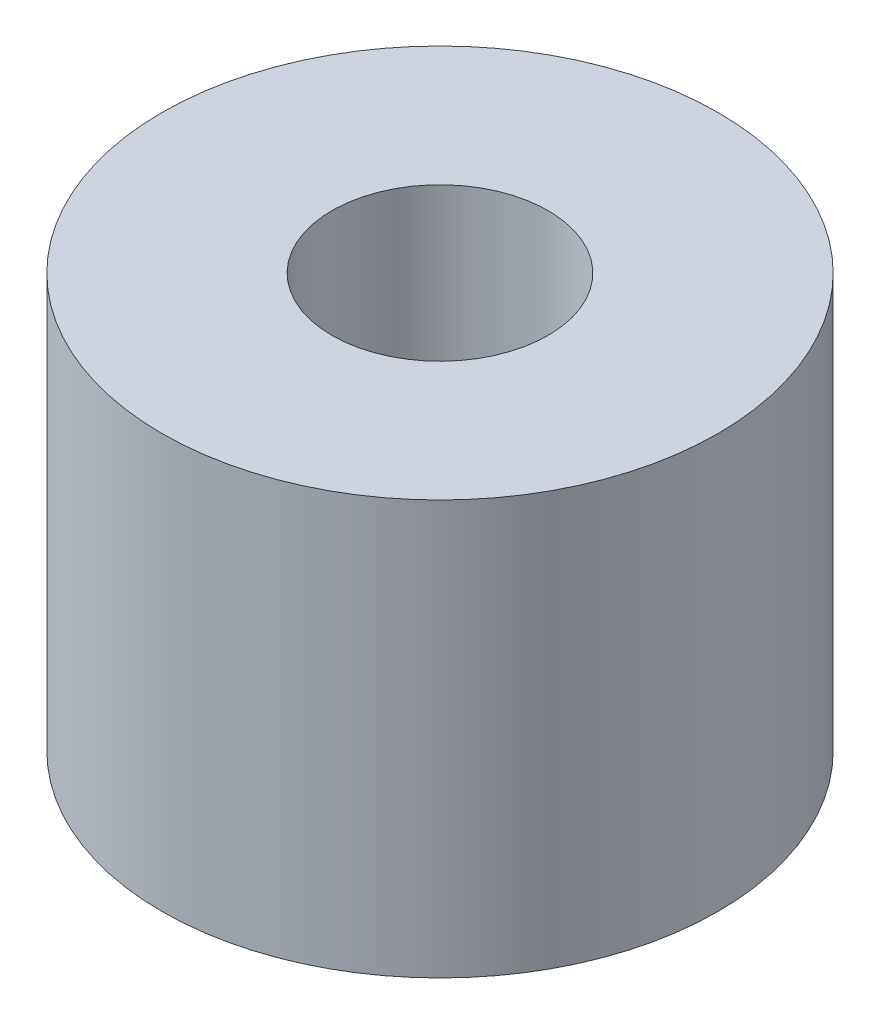
ISO-10303-21;
HEADER;
FILE_DESCRIPTION(('STEP AP214'),'2;1');
FILE_NAME('part.step','',(''),(''),'','','');
FILE_SCHEMA(('AUTOMOTIVE_DESIGN { 1 0 10303 214 1 1 1 1 }'));
ENDSEC;
DATA;
#1=APPLICATION_CONTEXT('core data for automotive mechanical design processes');
#2=APPLICATION_PROTOCOL_DEFINITION('international standard','automotive_design',2000,#1);
#3=PRODUCT_CONTEXT('',#1,'mechanical');
#4=PRODUCT('Part','Part','',(#3));
#5=PRODUCT_RELATED_PRODUCT_CATEGORY('part','',(#4));
#6=PRODUCT_DEFINITION_FORMATION('','',#4);
#7=PRODUCT_DEFINITION_CONTEXT('part definition',#1,'design');
#8=PRODUCT_DEFINITION('design','',#6,#7);
#9=PRODUCT_DEFINITION_SHAPE('','',#8);
#10=(LENGTH_UNIT() NAMED_UNIT(*) SI_UNIT(.MILLI.,.METRE.));
#11=(NAMED_UNIT(*) PLANE_ANGLE_UNIT() SI_UNIT($,.RADIAN.));
#12=(NAMED_UNIT(*) SI_UNIT($,.STERADIAN.) SOLID_ANGLE_UNIT());
#13=UNCERTAINTY_MEASURE_WITH_UNIT(LENGTH_MEASURE(1.E-05),#10,'distance_accuracy_value','');
#14=(GEOMETRIC_REPRESENTATION_CONTEXT(3) GLOBAL_UNCERTAINTY_ASSIGNED_CONTEXT((#13)) GLOBAL_UNIT_ASSIGNED_CONTEXT((#10,
#11,#12)) REPRESENTATION_CONTEXT('',''));
#15=CARTESIAN_POINT('',(0.,0.,0.));
#16=DIRECTION('',(0.,0.,1.));
#17=DIRECTION('',(1.,0.,0.));
#18=AXIS2_PLACEMENT_3D('',#15,#16,#17);
#19=CARTESIAN_POINT('',(0.,6.7,0.));
#20=DIRECTION('',(0.,-1.,0.));
#21=DIRECTION('',(0.,0.,-1.));
#22=AXIS2_PLACEMENT_3D('',#19,#20,#21);
#23=CYLINDRICAL_SURFACE('',#22,1.75);
#24=CARTESIAN_POINT('',(0.,6.7,0.));
#25=DIRECTION('',(0.,1.,0.));
#26=DIRECTION('',(0.,0.,1.));
#27=AXIS2_PLACEMENT_3D('',#24,#25,#26);
#28=CIRCLE('',#27,1.75);
#29=CARTESIAN_POINT('',(0.,6.7,1.75));
#30=VERTEX_POINT('',#29);
#31=EDGE_CURVE('E46',#30,#30,#28,.T.);
#32=ORIENTED_EDGE('',*,*,#31,.T.);
#33=EDGE_LOOP('',(#32));
#34=FACE_BOUND('',#33,.T.);
#35=CARTESIAN_POINT('',(0.,0.,0.));
#36=DIRECTION('',(0.,1.,0.));
#37=DIRECTION('',(0.,0.,1.));
#38=AXIS2_PLACEMENT_3D('',#35,#36,#37);
#39=CIRCLE('',#38,1.75);
#40=CARTESIAN_POINT('',(0.,0.,1.75));
#41=VERTEX_POINT('',#40);
#42=EDGE_CURVE('E52',#41,#41,#39,.T.);
#43=ORIENTED_EDGE('',*,*,#42,.F.);
#44=EDGE_LOOP('',(#43));
#45=FACE_BOUND('',#44,.T.);
#46=ADVANCED_FACE('F39',(#34,#45),#23,.F.);
#47=CARTESIAN_POINT('',(0.,6.7,0.));
#48=DIRECTION('',(0.,-1.,0.));
#49=DIRECTION('',(0.,0.,-1.));
#50=AXIS2_PLACEMENT_3D('',#47,#48,#49);
#51=CYLINDRICAL_SURFACE('',#50,4.5);
#52=CARTESIAN_POINT('',(0.,6.7,0.));
#53=DIRECTION('',(0.,1.,0.));
#54=DIRECTION('',(0.,0.,1.));
#55=AXIS2_PLACEMENT_3D('',#52,#53,#54);
#56=CIRCLE('',#55,4.5);
#57=CARTESIAN_POINT('',(0.,6.7,4.5));
#58=VERTEX_POINT('',#57);
#59=EDGE_CURVE('E10',#58,#58,#56,.T.);
#60=ORIENTED_EDGE('',*,*,#59,.F.);
#61=EDGE_LOOP('',(#60));
#62=FACE_BOUND('',#61,.T.);
#63=CARTESIAN_POINT('',(0.,0.,0.));
#64=DIRECTION('',(0.,1.,0.));
#65=DIRECTION('',(0.,0.,1.));
#66=AXIS2_PLACEMENT_3D('',#63,#64,#65);
#67=CIRCLE('',#66,4.5);
#68=CARTESIAN_POINT('',(0.,0.,4.5));
#69=VERTEX_POINT('',#68);
#70=EDGE_CURVE('E42',#69,#69,#67,.T.);
#71=ORIENTED_EDGE('',*,*,#70,.T.);
#72=EDGE_LOOP('',(#71));
#73=FACE_BOUND('',#72,.T.);
#74=ADVANCED_FACE('F59',(#62,#73),#51,.T.);
#75=CARTESIAN_POINT('',(0.,6.7,0.));
#76=DIRECTION('',(0.,1.,0.));
#77=DIRECTION('',(0.,0.,1.));
#78=AXIS2_PLACEMENT_3D('',#75,#76,#77);
#79=PLANE('',#78);
#80=ORIENTED_EDGE('',*,*,#31,.F.);
#81=EDGE_LOOP('',(#80));
#82=FACE_BOUND('',#81,.T.);
#83=ORIENTED_EDGE('',*,*,#59,.T.);
#84=EDGE_LOOP('',(#83));
#85=FACE_BOUND('',#84,.T.);
#86=ADVANCED_FACE('F63',(#82,#85),#79,.T.);
#87=CARTESIAN_POINT('',(0.,0.,0.));
#88=DIRECTION('',(0.,1.,0.));
#89=DIRECTION('',(0.,0.,1.));
#90=AXIS2_PLACEMENT_3D('',#87,#88,#89);
#91=PLANE('',#90);
#92=ORIENTED_EDGE('',*,*,#42,.T.);
#93=EDGE_LOOP('',(#92));
#94=FACE_BOUND('',#93,.T.);
#95=ORIENTED_EDGE('',*,*,#70,.F.);
#96=EDGE_LOOP('',(#95));
#97=FACE_BOUND('',#96,.T.);
#98=ADVANCED_FACE('F61',(#94,#97),#91,.F.);
#99=CLOSED_SHELL('',(#46,#74,#86,#98));
#100=MANIFOLD_SOLID_BREP('B2',#99);
#101=ADVANCED_BREP_SHAPE_REPRESENTATION('',(#18,#100),#14);
#102=SHAPE_DEFINITION_REPRESENTATION(#9,#101);
ENDSEC;
END-ISO-10303-21;
